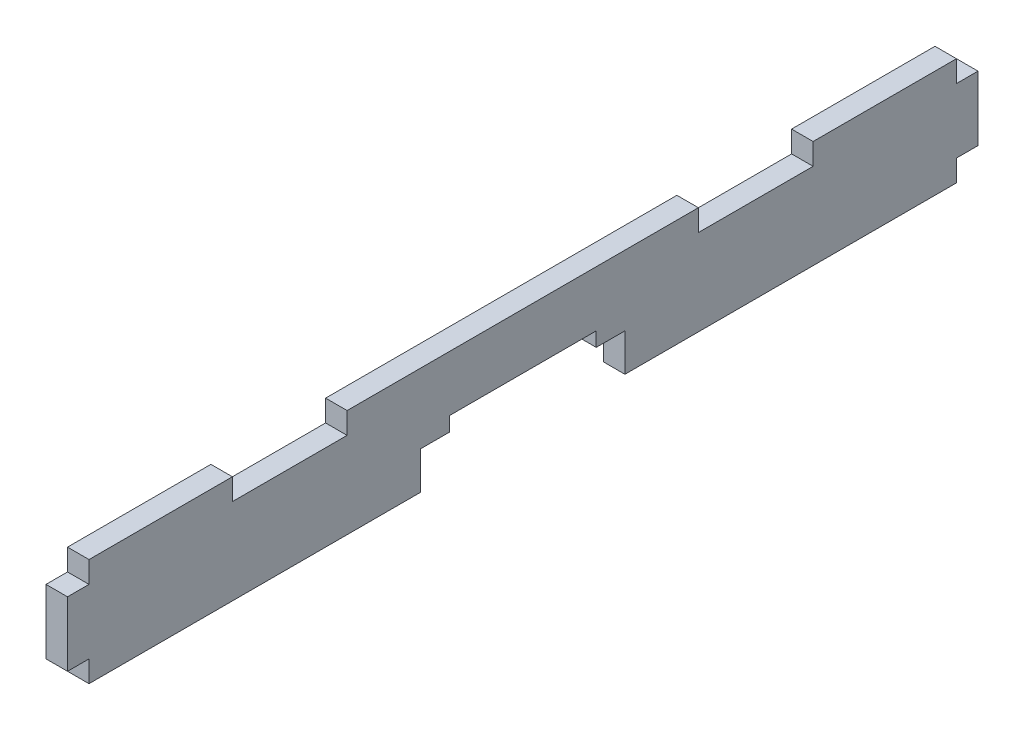
ISO-10303-21;
HEADER;
FILE_DESCRIPTION(('STEP AP214'),'2;1');
FILE_NAME('part.step','',(''),(''),'','','');
FILE_SCHEMA(('AUTOMOTIVE_DESIGN { 1 0 10303 214 1 1 1 1 }'));
ENDSEC;
DATA;
#1=APPLICATION_CONTEXT('core data for automotive mechanical design processes');
#2=APPLICATION_PROTOCOL_DEFINITION('international standard','automotive_design',2000,#1);
#3=PRODUCT_CONTEXT('',#1,'mechanical');
#4=PRODUCT('Part','Part','',(#3));
#5=PRODUCT_RELATED_PRODUCT_CATEGORY('part','',(#4));
#6=PRODUCT_DEFINITION_FORMATION('','',#4);
#7=PRODUCT_DEFINITION_CONTEXT('part definition',#1,'design');
#8=PRODUCT_DEFINITION('design','',#6,#7);
#9=PRODUCT_DEFINITION_SHAPE('','',#8);
#10=(LENGTH_UNIT() NAMED_UNIT(*) SI_UNIT(.MILLI.,.METRE.));
#11=(NAMED_UNIT(*) PLANE_ANGLE_UNIT() SI_UNIT($,.RADIAN.));
#12=(NAMED_UNIT(*) SI_UNIT($,.STERADIAN.) SOLID_ANGLE_UNIT());
#13=UNCERTAINTY_MEASURE_WITH_UNIT(LENGTH_MEASURE(1.E-05),#10,'distance_accuracy_value','');
#14=(GEOMETRIC_REPRESENTATION_CONTEXT(3) GLOBAL_UNCERTAINTY_ASSIGNED_CONTEXT((#13)) GLOBAL_UNIT_ASSIGNED_CONTEXT((#10,
#11,#12)) REPRESENTATION_CONTEXT('',''));
#15=CARTESIAN_POINT('',(0.,0.,0.));
#16=DIRECTION('',(0.,0.,1.));
#17=DIRECTION('',(1.,0.,0.));
#18=AXIS2_PLACEMENT_3D('',#15,#16,#17);
#19=CARTESIAN_POINT('',(3.,0.,-74.75));
#20=DIRECTION('',(0.,0.,1.));
#21=DIRECTION('',(1.,0.,0.));
#22=AXIS2_PLACEMENT_3D('',#19,#20,#21);
#23=PLANE('',#22);
#24=DIRECTION('',(0.,1.,0.));
#25=VECTOR('',#24,1.);
#26=CARTESIAN_POINT('',(0.,0.,-74.75));
#27=LINE('',#26,#25);
#28=CARTESIAN_POINT('',(0.,0.,-74.75));
#29=VERTEX_POINT('',#28);
#30=CARTESIAN_POINT('',(0.,5.25,-74.75));
#31=VERTEX_POINT('',#30);
#32=EDGE_CURVE('E252',#29,#31,#27,.T.);
#33=ORIENTED_EDGE('',*,*,#32,.F.);
#34=DIRECTION('',(-1.,0.,0.));
#35=VECTOR('',#34,1.);
#36=CARTESIAN_POINT('',(3.,0.,-74.75));
#37=LINE('',#36,#35);
#38=CARTESIAN_POINT('',(3.,0.,-74.75));
#39=VERTEX_POINT('',#38);
#40=EDGE_CURVE('E11',#39,#29,#37,.T.);
#41=ORIENTED_EDGE('',*,*,#40,.F.);
#42=DIRECTION('',(0.,1.,0.));
#43=VECTOR('',#42,1.);
#44=CARTESIAN_POINT('',(3.,0.,-74.75));
#45=LINE('',#44,#43);
#46=CARTESIAN_POINT('',(3.,5.25,-74.75));
#47=VERTEX_POINT('',#46);
#48=EDGE_CURVE('E442',#39,#47,#45,.T.);
#49=ORIENTED_EDGE('',*,*,#48,.T.);
#50=DIRECTION('',(-1.,0.,0.));
#51=VECTOR('',#50,1.);
#52=CARTESIAN_POINT('',(3.,5.25,-74.75));
#53=LINE('',#52,#51);
#54=EDGE_CURVE('E148',#47,#31,#53,.T.);
#55=ORIENTED_EDGE('',*,*,#54,.T.);
#56=EDGE_LOOP('',(#33,#41,#49,#55));
#57=FACE_BOUND('',#56,.T.);
#58=ADVANCED_FACE('F38',(#57),#23,.T.);
#59=CARTESIAN_POINT('',(3.,0.,0.));
#60=DIRECTION('',(0.,1.,0.));
#61=DIRECTION('',(0.,0.,1.));
#62=AXIS2_PLACEMENT_3D('',#59,#60,#61);
#63=PLANE('',#62);
#64=DIRECTION('',(0.,0.,-1.));
#65=VECTOR('',#64,1.);
#66=CARTESIAN_POINT('',(0.,0.,0.));
#67=LINE('',#66,#65);
#68=CARTESIAN_POINT('',(0.,0.,-121.));
#69=VERTEX_POINT('',#68);
#70=EDGE_CURVE('E255',#29,#69,#67,.T.);
#71=ORIENTED_EDGE('',*,*,#70,.T.);
#72=DIRECTION('',(-1.,0.,0.));
#73=VECTOR('',#72,1.);
#74=CARTESIAN_POINT('',(3.,0.,-121.));
#75=LINE('',#74,#73);
#76=CARTESIAN_POINT('',(3.,0.,-121.));
#77=VERTEX_POINT('',#76);
#78=EDGE_CURVE('E46',#77,#69,#75,.T.);
#79=ORIENTED_EDGE('',*,*,#78,.F.);
#80=DIRECTION('',(0.,0.,-1.));
#81=VECTOR('',#80,1.);
#82=CARTESIAN_POINT('',(3.,0.,0.));
#83=LINE('',#82,#81);
#84=EDGE_CURVE('E392',#39,#77,#83,.T.);
#85=ORIENTED_EDGE('',*,*,#84,.F.);
#86=ORIENTED_EDGE('',*,*,#40,.T.);
#87=EDGE_LOOP('',(#71,#79,#85,#86));
#88=FACE_BOUND('',#87,.T.);
#89=ADVANCED_FACE('F474',(#88),#63,.F.);
#90=CARTESIAN_POINT('',(3.,0.,-121.));
#91=DIRECTION('',(0.,0.,1.));
#92=DIRECTION('',(1.,0.,0.));
#93=AXIS2_PLACEMENT_3D('',#90,#91,#92);
#94=PLANE('',#93);
#95=DIRECTION('',(0.,1.,0.));
#96=VECTOR('',#95,1.);
#97=CARTESIAN_POINT('',(0.,0.,-121.));
#98=LINE('',#97,#96);
#99=CARTESIAN_POINT('',(0.,3.,-121.));
#100=VERTEX_POINT('',#99);
#101=EDGE_CURVE('E257',#69,#100,#98,.T.);
#102=ORIENTED_EDGE('',*,*,#101,.T.);
#103=DIRECTION('',(-1.,0.,0.));
#104=VECTOR('',#103,1.);
#105=CARTESIAN_POINT('',(3.,3.,-121.));
#106=LINE('',#105,#104);
#107=CARTESIAN_POINT('',(3.,3.,-121.));
#108=VERTEX_POINT('',#107);
#109=EDGE_CURVE('E365',#108,#100,#106,.T.);
#110=ORIENTED_EDGE('',*,*,#109,.F.);
#111=DIRECTION('',(0.,1.,0.));
#112=VECTOR('',#111,1.);
#113=CARTESIAN_POINT('',(3.,0.,-121.));
#114=LINE('',#113,#112);
#115=EDGE_CURVE('E374',#77,#108,#114,.T.);
#116=ORIENTED_EDGE('',*,*,#115,.F.);
#117=ORIENTED_EDGE('',*,*,#78,.T.);
#118=EDGE_LOOP('',(#102,#110,#116,#117));
#119=FACE_BOUND('',#118,.T.);
#120=ADVANCED_FACE('F372',(#119),#94,.F.);
#121=CARTESIAN_POINT('',(3.,2.99999999999937,0.));
#122=DIRECTION('',(0.,1.,0.));
#123=DIRECTION('',(0.,0.,1.));
#124=AXIS2_PLACEMENT_3D('',#121,#122,#123);
#125=PLANE('',#124);
#126=DIRECTION('',(0.,0.,-1.));
#127=VECTOR('',#126,1.);
#128=CARTESIAN_POINT('',(0.,2.99999999999937,0.));
#129=LINE('',#128,#127);
#130=CARTESIAN_POINT('',(0.,3.00000000000001,-124.));
#131=VERTEX_POINT('',#130);
#132=EDGE_CURVE('E260',#100,#131,#129,.T.);
#133=ORIENTED_EDGE('',*,*,#132,.T.);
#134=DIRECTION('',(-1.,0.,0.));
#135=VECTOR('',#134,1.);
#136=CARTESIAN_POINT('',(3.,3.00000000000001,-124.));
#137=LINE('',#136,#135);
#138=CARTESIAN_POINT('',(3.,3.00000000000001,-124.));
#139=VERTEX_POINT('',#138);
#140=EDGE_CURVE('E363',#139,#131,#137,.T.);
#141=ORIENTED_EDGE('',*,*,#140,.F.);
#142=DIRECTION('',(0.,0.,-1.));
#143=VECTOR('',#142,1.);
#144=CARTESIAN_POINT('',(3.,2.99999999999937,0.));
#145=LINE('',#144,#143);
#146=EDGE_CURVE('E386',#108,#139,#145,.T.);
#147=ORIENTED_EDGE('',*,*,#146,.F.);
#148=ORIENTED_EDGE('',*,*,#109,.T.);
#149=EDGE_LOOP('',(#133,#141,#147,#148));
#150=FACE_BOUND('',#149,.T.);
#151=ADVANCED_FACE('F383',(#150),#125,.F.);
#152=CARTESIAN_POINT('',(3.,0.,-124.));
#153=DIRECTION('',(0.,0.,-1.));
#154=DIRECTION('',(-1.,0.,0.));
#155=AXIS2_PLACEMENT_3D('',#152,#153,#154);
#156=PLANE('',#155);
#157=DIRECTION('',(0.,-1.,0.));
#158=VECTOR('',#157,1.);
#159=CARTESIAN_POINT('',(0.,0.,-124.));
#160=LINE('',#159,#158);
#161=CARTESIAN_POINT('',(0.,12.,-124.));
#162=VERTEX_POINT('',#161);
#163=EDGE_CURVE('E264',#162,#131,#160,.T.);
#164=ORIENTED_EDGE('',*,*,#163,.F.);
#165=DIRECTION('',(-1.,0.,0.));
#166=VECTOR('',#165,1.);
#167=CARTESIAN_POINT('',(3.,12.,-124.));
#168=LINE('',#167,#166);
#169=CARTESIAN_POINT('',(3.,12.,-124.));
#170=VERTEX_POINT('',#169);
#171=EDGE_CURVE('E361',#170,#162,#168,.T.);
#172=ORIENTED_EDGE('',*,*,#171,.F.);
#173=DIRECTION('',(0.,-1.,0.));
#174=VECTOR('',#173,1.);
#175=CARTESIAN_POINT('',(3.,0.,-124.));
#176=LINE('',#175,#174);
#177=EDGE_CURVE('E388',#170,#139,#176,.T.);
#178=ORIENTED_EDGE('',*,*,#177,.T.);
#179=ORIENTED_EDGE('',*,*,#140,.T.);
#180=EDGE_LOOP('',(#164,#172,#178,#179));
#181=FACE_BOUND('',#180,.T.);
#182=ADVANCED_FACE('F534',(#181),#156,.T.);
#183=CARTESIAN_POINT('',(3.,11.9999999999994,0.));
#184=DIRECTION('',(0.,1.,0.));
#185=DIRECTION('',(0.,0.,1.));
#186=AXIS2_PLACEMENT_3D('',#183,#184,#185);
#187=PLANE('',#186);
#188=DIRECTION('',(0.,0.,-1.));
#189=VECTOR('',#188,1.);
#190=CARTESIAN_POINT('',(0.,11.9999999999994,0.));
#191=LINE('',#190,#189);
#192=CARTESIAN_POINT('',(0.,12.,-121.));
#193=VERTEX_POINT('',#192);
#194=EDGE_CURVE('E267',#193,#162,#191,.T.);
#195=ORIENTED_EDGE('',*,*,#194,.F.);
#196=DIRECTION('',(-1.,0.,0.));
#197=VECTOR('',#196,1.);
#198=CARTESIAN_POINT('',(3.,12.,-121.));
#199=LINE('',#198,#197);
#200=CARTESIAN_POINT('',(3.,12.,-121.));
#201=VERTEX_POINT('',#200);
#202=EDGE_CURVE('E359',#201,#193,#199,.T.);
#203=ORIENTED_EDGE('',*,*,#202,.F.);
#204=DIRECTION('',(0.,0.,-1.));
#205=VECTOR('',#204,1.);
#206=CARTESIAN_POINT('',(3.,11.9999999999994,0.));
#207=LINE('',#206,#205);
#208=EDGE_CURVE('E390',#201,#170,#207,.T.);
#209=ORIENTED_EDGE('',*,*,#208,.T.);
#210=ORIENTED_EDGE('',*,*,#171,.T.);
#211=EDGE_LOOP('',(#195,#203,#209,#210));
#212=FACE_BOUND('',#211,.T.);
#213=ADVANCED_FACE('F530',(#212),#187,.T.);
#214=CARTESIAN_POINT('',(0.,15.,-121.));
#215=VERTEX_POINT('',#214);
#216=EDGE_CURVE('E261',#193,#215,#98,.T.);
#217=ORIENTED_EDGE('',*,*,#216,.T.);
#218=DIRECTION('',(-1.,0.,0.));
#219=VECTOR('',#218,1.);
#220=CARTESIAN_POINT('',(3.,15.,-121.));
#221=LINE('',#220,#219);
#222=CARTESIAN_POINT('',(3.,15.,-121.));
#223=VERTEX_POINT('',#222);
#224=EDGE_CURVE('E357',#223,#215,#221,.T.);
#225=ORIENTED_EDGE('',*,*,#224,.F.);
#226=EDGE_CURVE('E394',#201,#223,#114,.T.);
#227=ORIENTED_EDGE('',*,*,#226,.F.);
#228=ORIENTED_EDGE('',*,*,#202,.T.);
#229=EDGE_LOOP('',(#217,#225,#227,#228));
#230=FACE_BOUND('',#229,.T.);
#231=ADVANCED_FACE('F484',(#230),#94,.F.);
#232=CARTESIAN_POINT('',(3.,15.,0.));
#233=DIRECTION('',(0.,1.,0.));
#234=DIRECTION('',(0.,0.,1.));
#235=AXIS2_PLACEMENT_3D('',#232,#233,#234);
#236=PLANE('',#235);
#237=DIRECTION('',(0.,0.,-1.));
#238=VECTOR('',#237,1.);
#239=CARTESIAN_POINT('',(0.,15.,0.));
#240=LINE('',#239,#238);
#241=CARTESIAN_POINT('',(0.,15.,-101.));
#242=VERTEX_POINT('',#241);
#243=EDGE_CURVE('E270',#242,#215,#240,.T.);
#244=ORIENTED_EDGE('',*,*,#243,.F.);
#245=DIRECTION('',(-1.,0.,0.));
#246=VECTOR('',#245,1.);
#247=CARTESIAN_POINT('',(3.,15.,-101.));
#248=LINE('',#247,#246);
#249=CARTESIAN_POINT('',(3.,15.,-101.));
#250=VERTEX_POINT('',#249);
#251=EDGE_CURVE('E355',#250,#242,#248,.T.);
#252=ORIENTED_EDGE('',*,*,#251,.F.);
#253=DIRECTION('',(0.,0.,-1.));
#254=VECTOR('',#253,1.);
#255=CARTESIAN_POINT('',(3.,15.,0.));
#256=LINE('',#255,#254);
#257=EDGE_CURVE('E399',#250,#223,#256,.T.);
#258=ORIENTED_EDGE('',*,*,#257,.T.);
#259=ORIENTED_EDGE('',*,*,#224,.T.);
#260=EDGE_LOOP('',(#244,#252,#258,#259));
#261=FACE_BOUND('',#260,.T.);
#262=ADVANCED_FACE('F504',(#261),#236,.T.);
#263=CARTESIAN_POINT('',(3.,0.,-101.));
#264=DIRECTION('',(0.,0.,-1.));
#265=DIRECTION('',(-1.,0.,0.));
#266=AXIS2_PLACEMENT_3D('',#263,#264,#265);
#267=PLANE('',#266);
#268=DIRECTION('',(0.,-1.,0.));
#269=VECTOR('',#268,1.);
#270=CARTESIAN_POINT('',(0.,0.,-101.));
#271=LINE('',#270,#269);
#272=CARTESIAN_POINT('',(0.,12.,-101.));
#273=VERTEX_POINT('',#272);
#274=EDGE_CURVE('E273',#242,#273,#271,.T.);
#275=ORIENTED_EDGE('',*,*,#274,.T.);
#276=DIRECTION('',(-1.,0.,0.));
#277=VECTOR('',#276,1.);
#278=CARTESIAN_POINT('',(3.,12.,-101.));
#279=LINE('',#278,#277);
#280=CARTESIAN_POINT('',(3.,12.,-101.));
#281=VERTEX_POINT('',#280);
#282=EDGE_CURVE('E352',#281,#273,#279,.T.);
#283=ORIENTED_EDGE('',*,*,#282,.F.);
#284=DIRECTION('',(0.,-1.,0.));
#285=VECTOR('',#284,1.);
#286=CARTESIAN_POINT('',(3.,0.,-101.));
#287=LINE('',#286,#285);
#288=EDGE_CURVE('E402',#250,#281,#287,.T.);
#289=ORIENTED_EDGE('',*,*,#288,.F.);
#290=ORIENTED_EDGE('',*,*,#251,.T.);
#291=EDGE_LOOP('',(#275,#283,#289,#290));
#292=FACE_BOUND('',#291,.T.);
#293=ADVANCED_FACE('F524',(#292),#267,.F.);
#294=CARTESIAN_POINT('',(3.,12.,0.));
#295=DIRECTION('',(0.,-1.,0.));
#296=DIRECTION('',(0.,0.,-1.));
#297=AXIS2_PLACEMENT_3D('',#294,#295,#296);
#298=PLANE('',#297);
#299=DIRECTION('',(0.,0.,1.));
#300=VECTOR('',#299,1.);
#301=CARTESIAN_POINT('',(0.,12.,0.));
#302=LINE('',#301,#300);
#303=CARTESIAN_POINT('',(0.,12.,-85.));
#304=VERTEX_POINT('',#303);
#305=EDGE_CURVE('E277',#273,#304,#302,.T.);
#306=ORIENTED_EDGE('',*,*,#305,.T.);
#307=DIRECTION('',(-1.,0.,0.));
#308=VECTOR('',#307,1.);
#309=CARTESIAN_POINT('',(3.,12.,-85.));
#310=LINE('',#309,#308);
#311=CARTESIAN_POINT('',(3.,12.,-85.));
#312=VERTEX_POINT('',#311);
#313=EDGE_CURVE('E350',#312,#304,#310,.T.);
#314=ORIENTED_EDGE('',*,*,#313,.F.);
#315=DIRECTION('',(0.,0.,1.));
#316=VECTOR('',#315,1.);
#317=CARTESIAN_POINT('',(3.,12.,0.));
#318=LINE('',#317,#316);
#319=EDGE_CURVE('E406',#281,#312,#318,.T.);
#320=ORIENTED_EDGE('',*,*,#319,.F.);
#321=ORIENTED_EDGE('',*,*,#282,.T.);
#322=EDGE_LOOP('',(#306,#314,#320,#321));
#323=FACE_BOUND('',#322,.T.);
#324=ADVANCED_FACE('F520',(#323),#298,.F.);
#325=CARTESIAN_POINT('',(3.,0.,-85.));
#326=DIRECTION('',(0.,0.,-1.));
#327=DIRECTION('',(-1.,0.,0.));
#328=AXIS2_PLACEMENT_3D('',#325,#326,#327);
#329=PLANE('',#328);
#330=DIRECTION('',(0.,-1.,0.));
#331=VECTOR('',#330,1.);
#332=CARTESIAN_POINT('',(0.,0.,-85.));
#333=LINE('',#332,#331);
#334=CARTESIAN_POINT('',(0.,15.,-85.));
#335=VERTEX_POINT('',#334);
#336=EDGE_CURVE('E280',#335,#304,#333,.T.);
#337=ORIENTED_EDGE('',*,*,#336,.F.);
#338=DIRECTION('',(-1.,0.,0.));
#339=VECTOR('',#338,1.);
#340=CARTESIAN_POINT('',(3.,15.,-85.));
#341=LINE('',#340,#339);
#342=CARTESIAN_POINT('',(3.,15.,-85.));
#343=VERTEX_POINT('',#342);
#344=EDGE_CURVE('E348',#343,#335,#341,.T.);
#345=ORIENTED_EDGE('',*,*,#344,.F.);
#346=DIRECTION('',(0.,-1.,0.));
#347=VECTOR('',#346,1.);
#348=CARTESIAN_POINT('',(3.,0.,-85.));
#349=LINE('',#348,#347);
#350=EDGE_CURVE('E408',#343,#312,#349,.T.);
#351=ORIENTED_EDGE('',*,*,#350,.T.);
#352=ORIENTED_EDGE('',*,*,#313,.T.);
#353=EDGE_LOOP('',(#337,#345,#351,#352));
#354=FACE_BOUND('',#353,.T.);
#355=ADVANCED_FACE('F517',(#354),#329,.T.);
#356=CARTESIAN_POINT('',(0.,15.,-36.));
#357=VERTEX_POINT('',#356);
#358=EDGE_CURVE('E275',#357,#335,#240,.T.);
#359=ORIENTED_EDGE('',*,*,#358,.F.);
#360=DIRECTION('',(-1.,0.,0.));
#361=VECTOR('',#360,1.);
#362=CARTESIAN_POINT('',(3.,15.,-36.));
#363=LINE('',#362,#361);
#364=CARTESIAN_POINT('',(3.,15.,-36.));
#365=VERTEX_POINT('',#364);
#366=EDGE_CURVE('E346',#365,#357,#363,.T.);
#367=ORIENTED_EDGE('',*,*,#366,.F.);
#368=EDGE_CURVE('E404',#365,#343,#256,.T.);
#369=ORIENTED_EDGE('',*,*,#368,.T.);
#370=ORIENTED_EDGE('',*,*,#344,.T.);
#371=EDGE_LOOP('',(#359,#367,#369,#370));
#372=FACE_BOUND('',#371,.T.);
#373=ADVANCED_FACE('F505',(#372),#236,.T.);
#374=CARTESIAN_POINT('',(3.,0.,-36.));
#375=DIRECTION('',(0.,0.,-1.));
#376=DIRECTION('',(-1.,0.,0.));
#377=AXIS2_PLACEMENT_3D('',#374,#375,#376);
#378=PLANE('',#377);
#379=DIRECTION('',(0.,-1.,0.));
#380=VECTOR('',#379,1.);
#381=CARTESIAN_POINT('',(0.,0.,-36.));
#382=LINE('',#381,#380);
#383=CARTESIAN_POINT('',(0.,12.,-36.));
#384=VERTEX_POINT('',#383);
#385=EDGE_CURVE('E283',#357,#384,#382,.T.);
#386=ORIENTED_EDGE('',*,*,#385,.T.);
#387=DIRECTION('',(-1.,0.,0.));
#388=VECTOR('',#387,1.);
#389=CARTESIAN_POINT('',(3.,12.,-36.));
#390=LINE('',#389,#388);
#391=CARTESIAN_POINT('',(3.,12.,-36.));
#392=VERTEX_POINT('',#391);
#393=EDGE_CURVE('E344',#392,#384,#390,.T.);
#394=ORIENTED_EDGE('',*,*,#393,.F.);
#395=DIRECTION('',(0.,-1.,0.));
#396=VECTOR('',#395,1.);
#397=CARTESIAN_POINT('',(3.,0.,-36.));
#398=LINE('',#397,#396);
#399=EDGE_CURVE('E411',#365,#392,#398,.T.);
#400=ORIENTED_EDGE('',*,*,#399,.F.);
#401=ORIENTED_EDGE('',*,*,#366,.T.);
#402=EDGE_LOOP('',(#386,#394,#400,#401));
#403=FACE_BOUND('',#402,.T.);
#404=ADVANCED_FACE('F512',(#403),#378,.F.);
#405=CARTESIAN_POINT('',(3.,12.,0.));
#406=DIRECTION('',(0.,1.,0.));
#407=DIRECTION('',(0.,0.,1.));
#408=AXIS2_PLACEMENT_3D('',#405,#406,#407);
#409=PLANE('',#408);
#410=DIRECTION('',(0.,0.,-1.));
#411=VECTOR('',#410,1.);
#412=CARTESIAN_POINT('',(0.,12.,0.));
#413=LINE('',#412,#411);
#414=CARTESIAN_POINT('',(0.,12.,-20.));
#415=VERTEX_POINT('',#414);
#416=EDGE_CURVE('E286',#415,#384,#413,.T.);
#417=ORIENTED_EDGE('',*,*,#416,.F.);
#418=DIRECTION('',(-1.,0.,0.));
#419=VECTOR('',#418,1.);
#420=CARTESIAN_POINT('',(3.,12.,-20.));
#421=LINE('',#420,#419);
#422=CARTESIAN_POINT('',(3.,12.,-20.));
#423=VERTEX_POINT('',#422);
#424=EDGE_CURVE('E342',#423,#415,#421,.T.);
#425=ORIENTED_EDGE('',*,*,#424,.F.);
#426=DIRECTION('',(0.,0.,-1.));
#427=VECTOR('',#426,1.);
#428=CARTESIAN_POINT('',(3.,12.,0.));
#429=LINE('',#428,#427);
#430=EDGE_CURVE('E413',#423,#392,#429,.T.);
#431=ORIENTED_EDGE('',*,*,#430,.T.);
#432=ORIENTED_EDGE('',*,*,#393,.T.);
#433=EDGE_LOOP('',(#417,#425,#431,#432));
#434=FACE_BOUND('',#433,.T.);
#435=ADVANCED_FACE('F508',(#434),#409,.T.);
#436=CARTESIAN_POINT('',(3.,0.,-20.));
#437=DIRECTION('',(0.,0.,-1.));
#438=DIRECTION('',(-1.,0.,0.));
#439=AXIS2_PLACEMENT_3D('',#436,#437,#438);
#440=PLANE('',#439);
#441=DIRECTION('',(0.,-1.,0.));
#442=VECTOR('',#441,1.);
#443=CARTESIAN_POINT('',(0.,0.,-20.));
#444=LINE('',#443,#442);
#445=CARTESIAN_POINT('',(0.,15.,-20.));
#446=VERTEX_POINT('',#445);
#447=EDGE_CURVE('E289',#446,#415,#444,.T.);
#448=ORIENTED_EDGE('',*,*,#447,.F.);
#449=DIRECTION('',(-1.,0.,0.));
#450=VECTOR('',#449,1.);
#451=CARTESIAN_POINT('',(3.,15.,-20.));
#452=LINE('',#451,#450);
#453=CARTESIAN_POINT('',(3.,15.,-20.));
#454=VERTEX_POINT('',#453);
#455=EDGE_CURVE('E340',#454,#446,#452,.T.);
#456=ORIENTED_EDGE('',*,*,#455,.F.);
#457=DIRECTION('',(0.,-1.,0.));
#458=VECTOR('',#457,1.);
#459=CARTESIAN_POINT('',(3.,0.,-20.));
#460=LINE('',#459,#458);
#461=EDGE_CURVE('E416',#454,#423,#460,.T.);
#462=ORIENTED_EDGE('',*,*,#461,.T.);
#463=ORIENTED_EDGE('',*,*,#424,.T.);
#464=EDGE_LOOP('',(#448,#456,#462,#463));
#465=FACE_BOUND('',#464,.T.);
#466=ADVANCED_FACE('F502',(#465),#440,.T.);
#467=CARTESIAN_POINT('',(0.,15.,0.));
#468=VERTEX_POINT('',#467);
#469=EDGE_CURVE('E274',#468,#446,#240,.T.);
#470=ORIENTED_EDGE('',*,*,#469,.F.);
#471=DIRECTION('',(-1.,0.,0.));
#472=VECTOR('',#471,1.);
#473=CARTESIAN_POINT('',(3.,15.,0.));
#474=LINE('',#473,#472);
#475=CARTESIAN_POINT('',(3.,15.,0.));
#476=VERTEX_POINT('',#475);
#477=EDGE_CURVE('E338',#476,#468,#474,.T.);
#478=ORIENTED_EDGE('',*,*,#477,.F.);
#479=EDGE_CURVE('E403',#476,#454,#256,.T.);
#480=ORIENTED_EDGE('',*,*,#479,.T.);
#481=ORIENTED_EDGE('',*,*,#455,.T.);
#482=EDGE_LOOP('',(#470,#478,#480,#481));
#483=FACE_BOUND('',#482,.T.);
#484=ADVANCED_FACE('F499',(#483),#236,.T.);
#485=CARTESIAN_POINT('',(3.,0.,0.));
#486=DIRECTION('',(0.,0.,1.));
#487=DIRECTION('',(1.,0.,0.));
#488=AXIS2_PLACEMENT_3D('',#485,#486,#487);
#489=PLANE('',#488);
#490=DIRECTION('',(0.,1.,0.));
#491=VECTOR('',#490,1.);
#492=CARTESIAN_POINT('',(0.,0.,0.));
#493=LINE('',#492,#491);
#494=CARTESIAN_POINT('',(0.,12.,0.));
#495=VERTEX_POINT('',#494);
#496=EDGE_CURVE('E292',#495,#468,#493,.T.);
#497=ORIENTED_EDGE('',*,*,#496,.F.);
#498=DIRECTION('',(-1.,0.,0.));
#499=VECTOR('',#498,1.);
#500=CARTESIAN_POINT('',(3.,12.,0.));
#501=LINE('',#500,#499);
#502=CARTESIAN_POINT('',(3.,12.,0.));
#503=VERTEX_POINT('',#502);
#504=EDGE_CURVE('E336',#503,#495,#501,.T.);
#505=ORIENTED_EDGE('',*,*,#504,.F.);
#506=DIRECTION('',(0.,1.,0.));
#507=VECTOR('',#506,1.);
#508=CARTESIAN_POINT('',(3.,0.,0.));
#509=LINE('',#508,#507);
#510=EDGE_CURVE('E419',#503,#476,#509,.T.);
#511=ORIENTED_EDGE('',*,*,#510,.T.);
#512=ORIENTED_EDGE('',*,*,#477,.T.);
#513=EDGE_LOOP('',(#497,#505,#511,#512));
#514=FACE_BOUND('',#513,.T.);
#515=ADVANCED_FACE('F488',(#514),#489,.T.);
#516=CARTESIAN_POINT('',(3.,12.,0.));
#517=DIRECTION('',(0.,-1.,0.));
#518=DIRECTION('',(0.,0.,-1.));
#519=AXIS2_PLACEMENT_3D('',#516,#517,#518);
#520=PLANE('',#519);
#521=DIRECTION('',(0.,0.,1.));
#522=VECTOR('',#521,1.);
#523=CARTESIAN_POINT('',(0.,12.,0.));
#524=LINE('',#523,#522);
#525=CARTESIAN_POINT('',(0.,12.,3.));
#526=VERTEX_POINT('',#525);
#527=EDGE_CURVE('E295',#495,#526,#524,.T.);
#528=ORIENTED_EDGE('',*,*,#527,.T.);
#529=DIRECTION('',(-1.,0.,0.));
#530=VECTOR('',#529,1.);
#531=CARTESIAN_POINT('',(3.,12.,3.));
#532=LINE('',#531,#530);
#533=CARTESIAN_POINT('',(3.,12.,3.));
#534=VERTEX_POINT('',#533);
#535=EDGE_CURVE('E333',#534,#526,#532,.T.);
#536=ORIENTED_EDGE('',*,*,#535,.F.);
#537=DIRECTION('',(0.,0.,1.));
#538=VECTOR('',#537,1.);
#539=CARTESIAN_POINT('',(3.,12.,0.));
#540=LINE('',#539,#538);
#541=EDGE_CURVE('E422',#503,#534,#540,.T.);
#542=ORIENTED_EDGE('',*,*,#541,.F.);
#543=ORIENTED_EDGE('',*,*,#504,.T.);
#544=EDGE_LOOP('',(#528,#536,#542,#543));
#545=FACE_BOUND('',#544,.T.);
#546=ADVANCED_FACE('F494',(#545),#520,.F.);
#547=CARTESIAN_POINT('',(3.,0.,3.));
#548=DIRECTION('',(0.,0.,-1.));
#549=DIRECTION('',(0.,1.,0.));
#550=AXIS2_PLACEMENT_3D('',#547,#548,#549);
#551=PLANE('',#550);
#552=DIRECTION('',(0.,-1.,0.));
#553=VECTOR('',#552,1.);
#554=CARTESIAN_POINT('',(0.,0.,3.));
#555=LINE('',#554,#553);
#556=CARTESIAN_POINT('',(0.,3.,3.));
#557=VERTEX_POINT('',#556);
#558=EDGE_CURVE('E298',#526,#557,#555,.T.);
#559=ORIENTED_EDGE('',*,*,#558,.T.);
#560=DIRECTION('',(-1.,0.,0.));
#561=VECTOR('',#560,1.);
#562=CARTESIAN_POINT('',(3.,3.,3.));
#563=LINE('',#562,#561);
#564=CARTESIAN_POINT('',(3.,3.,3.));
#565=VERTEX_POINT('',#564);
#566=EDGE_CURVE('E331',#565,#557,#563,.T.);
#567=ORIENTED_EDGE('',*,*,#566,.F.);
#568=DIRECTION('',(0.,-1.,0.));
#569=VECTOR('',#568,1.);
#570=CARTESIAN_POINT('',(3.,0.,3.));
#571=LINE('',#570,#569);
#572=EDGE_CURVE('E425',#534,#565,#571,.T.);
#573=ORIENTED_EDGE('',*,*,#572,.F.);
#574=ORIENTED_EDGE('',*,*,#535,.T.);
#575=EDGE_LOOP('',(#559,#567,#573,#574));
#576=FACE_BOUND('',#575,.T.);
#577=ADVANCED_FACE('F491',(#576),#551,.F.);
#578=CARTESIAN_POINT('',(3.,3.,0.));
#579=DIRECTION('',(0.,-1.,0.));
#580=DIRECTION('',(0.,0.,-1.));
#581=AXIS2_PLACEMENT_3D('',#578,#579,#580);
#582=PLANE('',#581);
#583=DIRECTION('',(0.,0.,1.));
#584=VECTOR('',#583,1.);
#585=CARTESIAN_POINT('',(0.,3.,0.));
#586=LINE('',#585,#584);
#587=CARTESIAN_POINT('',(0.,3.,0.));
#588=VERTEX_POINT('',#587);
#589=EDGE_CURVE('E301',#588,#557,#586,.T.);
#590=ORIENTED_EDGE('',*,*,#589,.F.);
#591=DIRECTION('',(-1.,0.,0.));
#592=VECTOR('',#591,1.);
#593=CARTESIAN_POINT('',(3.,3.,0.));
#594=LINE('',#593,#592);
#595=CARTESIAN_POINT('',(3.,3.,0.));
#596=VERTEX_POINT('',#595);
#597=EDGE_CURVE('E329',#596,#588,#594,.T.);
#598=ORIENTED_EDGE('',*,*,#597,.F.);
#599=DIRECTION('',(0.,0.,1.));
#600=VECTOR('',#599,1.);
#601=CARTESIAN_POINT('',(3.,3.,0.));
#602=LINE('',#601,#600);
#603=EDGE_CURVE('E427',#596,#565,#602,.T.);
#604=ORIENTED_EDGE('',*,*,#603,.T.);
#605=ORIENTED_EDGE('',*,*,#566,.T.);
#606=EDGE_LOOP('',(#590,#598,#604,#605));
#607=FACE_BOUND('',#606,.T.);
#608=ADVANCED_FACE('F456',(#607),#582,.T.);
#609=CARTESIAN_POINT('',(0.,0.,0.));
#610=VERTEX_POINT('',#609);
#611=EDGE_CURVE('E296',#610,#588,#493,.T.);
#612=ORIENTED_EDGE('',*,*,#611,.F.);
#613=DIRECTION('',(-1.,0.,0.));
#614=VECTOR('',#613,1.);
#615=CARTESIAN_POINT('',(3.,0.,0.));
#616=LINE('',#615,#614);
#617=CARTESIAN_POINT('',(3.,0.,0.));
#618=VERTEX_POINT('',#617);
#619=EDGE_CURVE('E327',#618,#610,#616,.T.);
#620=ORIENTED_EDGE('',*,*,#619,.F.);
#621=EDGE_CURVE('E423',#618,#596,#509,.T.);
#622=ORIENTED_EDGE('',*,*,#621,.T.);
#623=ORIENTED_EDGE('',*,*,#597,.T.);
#624=EDGE_LOOP('',(#612,#620,#622,#623));
#625=FACE_BOUND('',#624,.T.);
#626=ADVANCED_FACE('F450',(#625),#489,.T.);
#627=CARTESIAN_POINT('',(0.,0.,-46.25));
#628=VERTEX_POINT('',#627);
#629=EDGE_CURVE('E258',#610,#628,#67,.T.);
#630=ORIENTED_EDGE('',*,*,#629,.T.);
#631=DIRECTION('',(-1.,0.,0.));
#632=VECTOR('',#631,1.);
#633=CARTESIAN_POINT('',(3.,0.,-46.25));
#634=LINE('',#633,#632);
#635=CARTESIAN_POINT('',(3.,0.,-46.25));
#636=VERTEX_POINT('',#635);
#637=EDGE_CURVE('E324',#636,#628,#634,.T.);
#638=ORIENTED_EDGE('',*,*,#637,.F.);
#639=EDGE_CURVE('E431',#618,#636,#83,.T.);
#640=ORIENTED_EDGE('',*,*,#639,.F.);
#641=ORIENTED_EDGE('',*,*,#619,.T.);
#642=EDGE_LOOP('',(#630,#638,#640,#641));
#643=FACE_BOUND('',#642,.T.);
#644=ADVANCED_FACE('F462',(#643),#63,.F.);
#645=CARTESIAN_POINT('',(3.,0.,-46.25));
#646=DIRECTION('',(0.,0.,1.));
#647=DIRECTION('',(1.,0.,0.));
#648=AXIS2_PLACEMENT_3D('',#645,#646,#647);
#649=PLANE('',#648);
#650=DIRECTION('',(0.,1.,0.));
#651=VECTOR('',#650,1.);
#652=CARTESIAN_POINT('',(0.,0.,-46.25));
#653=LINE('',#652,#651);
#654=CARTESIAN_POINT('',(0.,5.25,-46.25));
#655=VERTEX_POINT('',#654);
#656=EDGE_CURVE('E304',#628,#655,#653,.T.);
#657=ORIENTED_EDGE('',*,*,#656,.T.);
#658=DIRECTION('',(-1.,0.,0.));
#659=VECTOR('',#658,1.);
#660=CARTESIAN_POINT('',(3.,5.25,-46.25));
#661=LINE('',#660,#659);
#662=CARTESIAN_POINT('',(3.,5.25,-46.25));
#663=VERTEX_POINT('',#662);
#664=EDGE_CURVE('E321',#663,#655,#661,.T.);
#665=ORIENTED_EDGE('',*,*,#664,.F.);
#666=DIRECTION('',(0.,1.,0.));
#667=VECTOR('',#666,1.);
#668=CARTESIAN_POINT('',(3.,0.,-46.25));
#669=LINE('',#668,#667);
#670=EDGE_CURVE('E430',#636,#663,#669,.T.);
#671=ORIENTED_EDGE('',*,*,#670,.F.);
#672=ORIENTED_EDGE('',*,*,#637,.T.);
#673=EDGE_LOOP('',(#657,#665,#671,#672));
#674=FACE_BOUND('',#673,.T.);
#675=ADVANCED_FACE('F464',(#674),#649,.F.);
#676=CARTESIAN_POINT('',(3.,5.25,0.));
#677=DIRECTION('',(0.,1.,0.));
#678=DIRECTION('',(0.,0.,1.));
#679=AXIS2_PLACEMENT_3D('',#676,#677,#678);
#680=PLANE('',#679);
#681=DIRECTION('',(0.,0.,-1.));
#682=VECTOR('',#681,1.);
#683=CARTESIAN_POINT('',(0.,5.25,0.));
#684=LINE('',#683,#682);
#685=CARTESIAN_POINT('',(0.,5.25,-50.25));
#686=VERTEX_POINT('',#685);
#687=EDGE_CURVE('E306',#655,#686,#684,.T.);
#688=ORIENTED_EDGE('',*,*,#687,.T.);
#689=DIRECTION('',(-1.,0.,0.));
#690=VECTOR('',#689,1.);
#691=CARTESIAN_POINT('',(3.,5.25,-50.25));
#692=LINE('',#691,#690);
#693=CARTESIAN_POINT('',(3.,5.25,-50.25));
#694=VERTEX_POINT('',#693);
#695=EDGE_CURVE('E318',#694,#686,#692,.T.);
#696=ORIENTED_EDGE('',*,*,#695,.F.);
#697=DIRECTION('',(0.,0.,-1.));
#698=VECTOR('',#697,1.);
#699=CARTESIAN_POINT('',(3.,5.25,0.));
#700=LINE('',#699,#698);
#701=EDGE_CURVE('E249',#663,#694,#700,.T.);
#702=ORIENTED_EDGE('',*,*,#701,.F.);
#703=ORIENTED_EDGE('',*,*,#664,.T.);
#704=EDGE_LOOP('',(#688,#696,#702,#703));
#705=FACE_BOUND('',#704,.T.);
#706=ADVANCED_FACE('F437',(#705),#680,.F.);
#707=CARTESIAN_POINT('',(3.,0.,-50.25));
#708=DIRECTION('',(0.,0.,1.));
#709=DIRECTION('',(1.,0.,0.));
#710=AXIS2_PLACEMENT_3D('',#707,#708,#709);
#711=PLANE('',#710);
#712=DIRECTION('',(0.,1.,0.));
#713=VECTOR('',#712,1.);
#714=CARTESIAN_POINT('',(0.,0.,-50.25));
#715=LINE('',#714,#713);
#716=CARTESIAN_POINT('',(0.,7.25,-50.25));
#717=VERTEX_POINT('',#716);
#718=EDGE_CURVE('E308',#686,#717,#715,.T.);
#719=ORIENTED_EDGE('',*,*,#718,.T.);
#720=DIRECTION('',(-1.,0.,0.));
#721=VECTOR('',#720,1.);
#722=CARTESIAN_POINT('',(3.,7.25,-50.25));
#723=LINE('',#722,#721);
#724=CARTESIAN_POINT('',(3.,7.25,-50.25));
#725=VERTEX_POINT('',#724);
#726=EDGE_CURVE('E238',#725,#717,#723,.T.);
#727=ORIENTED_EDGE('',*,*,#726,.F.);
#728=DIRECTION('',(0.,1.,0.));
#729=VECTOR('',#728,1.);
#730=CARTESIAN_POINT('',(3.,0.,-50.25));
#731=LINE('',#730,#729);
#732=EDGE_CURVE('E243',#694,#725,#731,.T.);
#733=ORIENTED_EDGE('',*,*,#732,.F.);
#734=ORIENTED_EDGE('',*,*,#695,.T.);
#735=EDGE_LOOP('',(#719,#727,#733,#734));
#736=FACE_BOUND('',#735,.T.);
#737=ADVANCED_FACE('F441',(#736),#711,.F.);
#738=CARTESIAN_POINT('',(3.,7.25,0.));
#739=DIRECTION('',(0.,-1.,0.));
#740=DIRECTION('',(0.,0.,-1.));
#741=AXIS2_PLACEMENT_3D('',#738,#739,#740);
#742=PLANE('',#741);
#743=DIRECTION('',(0.,0.,1.));
#744=VECTOR('',#743,1.);
#745=CARTESIAN_POINT('',(0.,7.25,0.));
#746=LINE('',#745,#744);
#747=CARTESIAN_POINT('',(0.,7.25,-70.75));
#748=VERTEX_POINT('',#747);
#749=EDGE_CURVE('E233',#748,#717,#746,.T.);
#750=ORIENTED_EDGE('',*,*,#749,.F.);
#751=DIRECTION('',(-1.,0.,0.));
#752=VECTOR('',#751,1.);
#753=CARTESIAN_POINT('',(3.,7.25,-70.75));
#754=LINE('',#753,#752);
#755=CARTESIAN_POINT('',(3.,7.25,-70.75));
#756=VERTEX_POINT('',#755);
#757=EDGE_CURVE('E228',#756,#748,#754,.T.);
#758=ORIENTED_EDGE('',*,*,#757,.F.);
#759=DIRECTION('',(0.,0.,1.));
#760=VECTOR('',#759,1.);
#761=CARTESIAN_POINT('',(3.,7.25,0.));
#762=LINE('',#761,#760);
#763=EDGE_CURVE('E231',#756,#725,#762,.T.);
#764=ORIENTED_EDGE('',*,*,#763,.T.);
#765=ORIENTED_EDGE('',*,*,#726,.T.);
#766=EDGE_LOOP('',(#750,#758,#764,#765));
#767=FACE_BOUND('',#766,.T.);
#768=ADVANCED_FACE('F230',(#767),#742,.T.);
#769=CARTESIAN_POINT('',(3.,0.,-70.75));
#770=DIRECTION('',(0.,0.,1.));
#771=DIRECTION('',(1.,0.,0.));
#772=AXIS2_PLACEMENT_3D('',#769,#770,#771);
#773=PLANE('',#772);
#774=DIRECTION('',(0.,1.,0.));
#775=VECTOR('',#774,1.);
#776=CARTESIAN_POINT('',(0.,0.,-70.75));
#777=LINE('',#776,#775);
#778=CARTESIAN_POINT('',(0.,5.25,-70.75));
#779=VERTEX_POINT('',#778);
#780=EDGE_CURVE('E313',#779,#748,#777,.T.);
#781=ORIENTED_EDGE('',*,*,#780,.F.);
#782=DIRECTION('',(-1.,0.,0.));
#783=VECTOR('',#782,1.);
#784=CARTESIAN_POINT('',(3.,5.25,-70.75));
#785=LINE('',#784,#783);
#786=CARTESIAN_POINT('',(3.,5.25,-70.75));
#787=VERTEX_POINT('',#786);
#788=EDGE_CURVE('E141',#787,#779,#785,.T.);
#789=ORIENTED_EDGE('',*,*,#788,.F.);
#790=DIRECTION('',(0.,1.,0.));
#791=VECTOR('',#790,1.);
#792=CARTESIAN_POINT('',(3.,0.,-70.75));
#793=LINE('',#792,#791);
#794=EDGE_CURVE('E241',#787,#756,#793,.T.);
#795=ORIENTED_EDGE('',*,*,#794,.T.);
#796=ORIENTED_EDGE('',*,*,#757,.T.);
#797=EDGE_LOOP('',(#781,#789,#795,#796));
#798=FACE_BOUND('',#797,.T.);
#799=ADVANCED_FACE('F246',(#798),#773,.T.);
#800=EDGE_CURVE('E309',#779,#31,#684,.T.);
#801=ORIENTED_EDGE('',*,*,#800,.T.);
#802=ORIENTED_EDGE('',*,*,#54,.F.);
#803=EDGE_CURVE('E54',#787,#47,#700,.T.);
#804=ORIENTED_EDGE('',*,*,#803,.F.);
#805=ORIENTED_EDGE('',*,*,#788,.T.);
#806=EDGE_LOOP('',(#801,#802,#804,#805));
#807=FACE_BOUND('',#806,.T.);
#808=ADVANCED_FACE('F472',(#807),#680,.F.);
#809=CARTESIAN_POINT('',(3.,0.,0.));
#810=DIRECTION('',(1.,0.,0.));
#811=DIRECTION('',(0.,0.,-1.));
#812=AXIS2_PLACEMENT_3D('',#809,#810,#811);
#813=PLANE('',#812);
#814=ORIENTED_EDGE('',*,*,#48,.F.);
#815=ORIENTED_EDGE('',*,*,#84,.T.);
#816=ORIENTED_EDGE('',*,*,#115,.T.);
#817=ORIENTED_EDGE('',*,*,#146,.T.);
#818=ORIENTED_EDGE('',*,*,#177,.F.);
#819=ORIENTED_EDGE('',*,*,#208,.F.);
#820=ORIENTED_EDGE('',*,*,#226,.T.);
#821=ORIENTED_EDGE('',*,*,#257,.F.);
#822=ORIENTED_EDGE('',*,*,#288,.T.);
#823=ORIENTED_EDGE('',*,*,#319,.T.);
#824=ORIENTED_EDGE('',*,*,#350,.F.);
#825=ORIENTED_EDGE('',*,*,#368,.F.);
#826=ORIENTED_EDGE('',*,*,#399,.T.);
#827=ORIENTED_EDGE('',*,*,#430,.F.);
#828=ORIENTED_EDGE('',*,*,#461,.F.);
#829=ORIENTED_EDGE('',*,*,#479,.F.);
#830=ORIENTED_EDGE('',*,*,#510,.F.);
#831=ORIENTED_EDGE('',*,*,#541,.T.);
#832=ORIENTED_EDGE('',*,*,#572,.T.);
#833=ORIENTED_EDGE('',*,*,#603,.F.);
#834=ORIENTED_EDGE('',*,*,#621,.F.);
#835=ORIENTED_EDGE('',*,*,#639,.T.);
#836=ORIENTED_EDGE('',*,*,#670,.T.);
#837=ORIENTED_EDGE('',*,*,#701,.T.);
#838=ORIENTED_EDGE('',*,*,#732,.T.);
#839=ORIENTED_EDGE('',*,*,#763,.F.);
#840=ORIENTED_EDGE('',*,*,#794,.F.);
#841=ORIENTED_EDGE('',*,*,#803,.T.);
#842=EDGE_LOOP('',(#814,#815,#816,#817,#818,#819,#820,#821,#822,#823,#824,#825,#826,#827,#828,
#829,#830,#831,#832,#833,#834,#835,#836,#837,#838,#839,#840,#841));
#843=FACE_BOUND('',#842,.T.);
#844=ADVANCED_FACE('F240',(#843),#813,.T.);
#845=CARTESIAN_POINT('',(0.,0.,0.));
#846=DIRECTION('',(1.,0.,0.));
#847=DIRECTION('',(0.,0.,-1.));
#848=AXIS2_PLACEMENT_3D('',#845,#846,#847);
#849=PLANE('',#848);
#850=ORIENTED_EDGE('',*,*,#32,.T.);
#851=ORIENTED_EDGE('',*,*,#800,.F.);
#852=ORIENTED_EDGE('',*,*,#780,.T.);
#853=ORIENTED_EDGE('',*,*,#749,.T.);
#854=ORIENTED_EDGE('',*,*,#718,.F.);
#855=ORIENTED_EDGE('',*,*,#687,.F.);
#856=ORIENTED_EDGE('',*,*,#656,.F.);
#857=ORIENTED_EDGE('',*,*,#629,.F.);
#858=ORIENTED_EDGE('',*,*,#611,.T.);
#859=ORIENTED_EDGE('',*,*,#589,.T.);
#860=ORIENTED_EDGE('',*,*,#558,.F.);
#861=ORIENTED_EDGE('',*,*,#527,.F.);
#862=ORIENTED_EDGE('',*,*,#496,.T.);
#863=ORIENTED_EDGE('',*,*,#469,.T.);
#864=ORIENTED_EDGE('',*,*,#447,.T.);
#865=ORIENTED_EDGE('',*,*,#416,.T.);
#866=ORIENTED_EDGE('',*,*,#385,.F.);
#867=ORIENTED_EDGE('',*,*,#358,.T.);
#868=ORIENTED_EDGE('',*,*,#336,.T.);
#869=ORIENTED_EDGE('',*,*,#305,.F.);
#870=ORIENTED_EDGE('',*,*,#274,.F.);
#871=ORIENTED_EDGE('',*,*,#243,.T.);
#872=ORIENTED_EDGE('',*,*,#216,.F.);
#873=ORIENTED_EDGE('',*,*,#194,.T.);
#874=ORIENTED_EDGE('',*,*,#163,.T.);
#875=ORIENTED_EDGE('',*,*,#132,.F.);
#876=ORIENTED_EDGE('',*,*,#101,.F.);
#877=ORIENTED_EDGE('',*,*,#70,.F.);
#878=EDGE_LOOP('',(#850,#851,#852,#853,#854,#855,#856,#857,#858,#859,#860,#861,#862,#863,#864,
#865,#866,#867,#868,#869,#870,#871,#872,#873,#874,#875,#876,#877));
#879=FACE_BOUND('',#878,.T.);
#880=ADVANCED_FACE('F379',(#879),#849,.F.);
#881=CLOSED_SHELL('',(#58,#89,#120,#151,#182,#213,#231,#262,#293,#324,#355,#373,#404,#435,#466,
#484,#515,#546,#577,#608,#626,#644,#675,#706,#737,#768,#799,#808,#844,#880));
#882=MANIFOLD_SOLID_BREP('B2',#881);
#883=ADVANCED_BREP_SHAPE_REPRESENTATION('',(#18,#882),#14);
#884=SHAPE_DEFINITION_REPRESENTATION(#9,#883);
ENDSEC;
END-ISO-10303-21;
